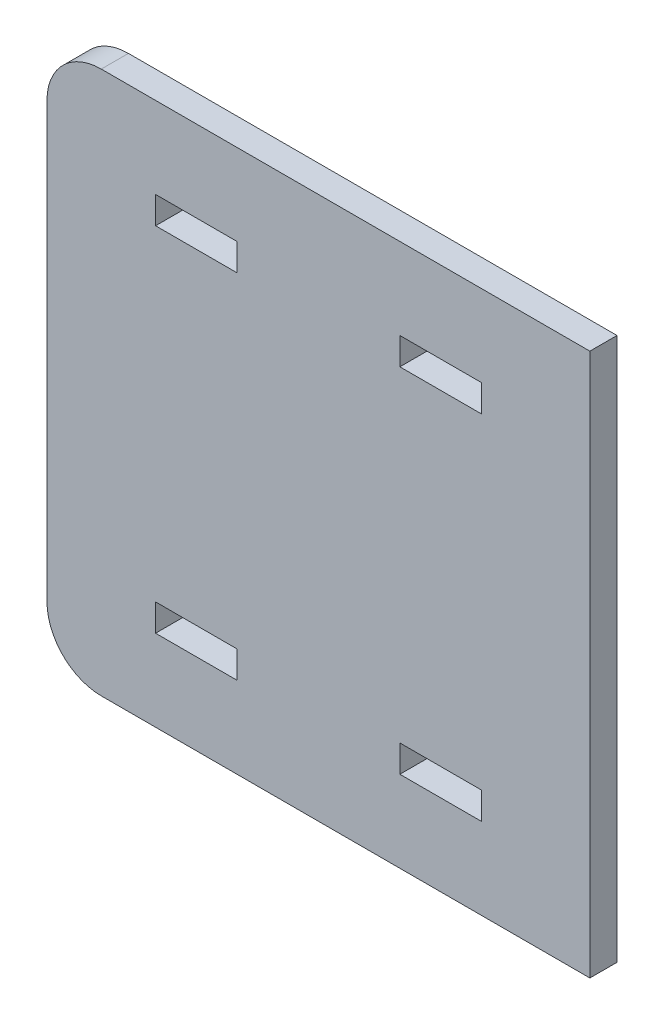
ISO-10303-21;
HEADER;
FILE_DESCRIPTION(('STEP AP214'),'2;1');
FILE_NAME('part.step','',(''),(''),'','','');
FILE_SCHEMA(('AUTOMOTIVE_DESIGN { 1 0 10303 214 1 1 1 1 }'));
ENDSEC;
DATA;
#1=APPLICATION_CONTEXT('core data for automotive mechanical design processes');
#2=APPLICATION_PROTOCOL_DEFINITION('international standard','automotive_design',2000,#1);
#3=PRODUCT_CONTEXT('',#1,'mechanical');
#4=PRODUCT('Part','Part','',(#3));
#5=PRODUCT_RELATED_PRODUCT_CATEGORY('part','',(#4));
#6=PRODUCT_DEFINITION_FORMATION('','',#4);
#7=PRODUCT_DEFINITION_CONTEXT('part definition',#1,'design');
#8=PRODUCT_DEFINITION('design','',#6,#7);
#9=PRODUCT_DEFINITION_SHAPE('','',#8);
#10=(LENGTH_UNIT() NAMED_UNIT(*) SI_UNIT(.MILLI.,.METRE.));
#11=(NAMED_UNIT(*) PLANE_ANGLE_UNIT() SI_UNIT($,.RADIAN.));
#12=(NAMED_UNIT(*) SI_UNIT($,.STERADIAN.) SOLID_ANGLE_UNIT());
#13=UNCERTAINTY_MEASURE_WITH_UNIT(LENGTH_MEASURE(1.E-05),#10,'distance_accuracy_value','');
#14=(GEOMETRIC_REPRESENTATION_CONTEXT(3) GLOBAL_UNCERTAINTY_ASSIGNED_CONTEXT((#13)) GLOBAL_UNIT_ASSIGNED_CONTEXT((#10,
#11,#12)) REPRESENTATION_CONTEXT('',''));
#15=CARTESIAN_POINT('',(0.,0.,0.));
#16=DIRECTION('',(0.,0.,1.));
#17=DIRECTION('',(1.,0.,0.));
#18=AXIS2_PLACEMENT_3D('',#15,#16,#17);
#19=CARTESIAN_POINT('',(0.,100.,5.));
#20=DIRECTION('',(0.,0.,-1.));
#21=DIRECTION('',(-1.,0.,0.));
#22=AXIS2_PLACEMENT_3D('',#19,#20,#21);
#23=PLANE('',#22);
#24=DIRECTION('',(1.,0.,0.));
#25=VECTOR('',#24,1.);
#26=CARTESIAN_POINT('',(65.,80.,5.));
#27=LINE('',#26,#25);
#28=CARTESIAN_POINT('',(65.,80.,5.));
#29=VERTEX_POINT('',#28);
#30=CARTESIAN_POINT('',(80.,80.,5.));
#31=VERTEX_POINT('',#30);
#32=EDGE_CURVE('E224',#29,#31,#27,.T.);
#33=ORIENTED_EDGE('',*,*,#32,.F.);
#34=DIRECTION('',(0.,-1.,0.));
#35=VECTOR('',#34,1.);
#36=CARTESIAN_POINT('',(65.,80.,5.));
#37=LINE('',#36,#35);
#38=CARTESIAN_POINT('',(65.,85.,5.));
#39=VERTEX_POINT('',#38);
#40=EDGE_CURVE('E232',#39,#29,#37,.T.);
#41=ORIENTED_EDGE('',*,*,#40,.F.);
#42=DIRECTION('',(-1.,0.,0.));
#43=VECTOR('',#42,1.);
#44=CARTESIAN_POINT('',(65.,85.,5.));
#45=LINE('',#44,#43);
#46=CARTESIAN_POINT('',(80.,85.,5.));
#47=VERTEX_POINT('',#46);
#48=EDGE_CURVE('E229',#47,#39,#45,.T.);
#49=ORIENTED_EDGE('',*,*,#48,.F.);
#50=DIRECTION('',(0.,1.,0.));
#51=VECTOR('',#50,1.);
#52=CARTESIAN_POINT('',(80.,80.,5.));
#53=LINE('',#52,#51);
#54=EDGE_CURVE('E226',#31,#47,#53,.T.);
#55=ORIENTED_EDGE('',*,*,#54,.F.);
#56=EDGE_LOOP('',(#33,#41,#49,#55));
#57=FACE_BOUND('',#56,.T.);
#58=DIRECTION('',(0.,-1.,0.));
#59=VECTOR('',#58,1.);
#60=CARTESIAN_POINT('',(20.,20.,5.));
#61=LINE('',#60,#59);
#62=CARTESIAN_POINT('',(20.,20.,5.));
#63=VERTEX_POINT('',#62);
#64=CARTESIAN_POINT('',(20.,15.,5.));
#65=VERTEX_POINT('',#64);
#66=EDGE_CURVE('E286',#63,#65,#61,.T.);
#67=ORIENTED_EDGE('',*,*,#66,.F.);
#68=DIRECTION('',(-1.,0.,0.));
#69=VECTOR('',#68,1.);
#70=CARTESIAN_POINT('',(20.,20.,5.));
#71=LINE('',#70,#69);
#72=CARTESIAN_POINT('',(35.,20.,5.));
#73=VERTEX_POINT('',#72);
#74=EDGE_CURVE('E294',#73,#63,#71,.T.);
#75=ORIENTED_EDGE('',*,*,#74,.F.);
#76=DIRECTION('',(0.,1.,0.));
#77=VECTOR('',#76,1.);
#78=CARTESIAN_POINT('',(35.,20.,5.));
#79=LINE('',#78,#77);
#80=CARTESIAN_POINT('',(35.,15.,5.));
#81=VERTEX_POINT('',#80);
#82=EDGE_CURVE('E291',#81,#73,#79,.T.);
#83=ORIENTED_EDGE('',*,*,#82,.F.);
#84=DIRECTION('',(1.,0.,0.));
#85=VECTOR('',#84,1.);
#86=CARTESIAN_POINT('',(20.,15.,5.));
#87=LINE('',#86,#85);
#88=EDGE_CURVE('E288',#65,#81,#87,.T.);
#89=ORIENTED_EDGE('',*,*,#88,.F.);
#90=EDGE_LOOP('',(#67,#75,#83,#89));
#91=FACE_BOUND('',#90,.T.);
#92=DIRECTION('',(0.,-1.,0.));
#93=VECTOR('',#92,1.);
#94=CARTESIAN_POINT('',(0.,0.,5.));
#95=LINE('',#94,#93);
#96=CARTESIAN_POINT('',(0.,90.,5.));
#97=VERTEX_POINT('',#96);
#98=CARTESIAN_POINT('',(0.,10.,5.));
#99=VERTEX_POINT('',#98);
#100=EDGE_CURVE('E317',#97,#99,#95,.T.);
#101=ORIENTED_EDGE('',*,*,#100,.T.);
#102=CARTESIAN_POINT('',(10.,10.,5.));
#103=DIRECTION('',(0.,0.,-1.));
#104=DIRECTION('',(-1.,0.,0.));
#105=AXIS2_PLACEMENT_3D('',#102,#103,#104);
#106=CIRCLE('',#105,10.);
#107=CARTESIAN_POINT('',(10.,0.,5.));
#108=VERTEX_POINT('',#107);
#109=EDGE_CURVE('E39',#99,#108,#106,.F.);
#110=ORIENTED_EDGE('',*,*,#109,.T.);
#111=DIRECTION('',(1.,0.,0.));
#112=VECTOR('',#111,1.);
#113=CARTESIAN_POINT('',(0.,0.,5.));
#114=LINE('',#113,#112);
#115=CARTESIAN_POINT('',(100.,0.,5.));
#116=VERTEX_POINT('',#115);
#117=EDGE_CURVE('E319',#108,#116,#114,.T.);
#118=ORIENTED_EDGE('',*,*,#117,.T.);
#119=DIRECTION('',(0.,1.,0.));
#120=VECTOR('',#119,1.);
#121=CARTESIAN_POINT('',(100.,0.,5.));
#122=LINE('',#121,#120);
#123=CARTESIAN_POINT('',(100.,100.,5.));
#124=VERTEX_POINT('',#123);
#125=EDGE_CURVE('E322',#116,#124,#122,.T.);
#126=ORIENTED_EDGE('',*,*,#125,.T.);
#127=DIRECTION('',(-1.,0.,0.));
#128=VECTOR('',#127,1.);
#129=CARTESIAN_POINT('',(0.,100.,5.));
#130=LINE('',#129,#128);
#131=CARTESIAN_POINT('',(10.,100.,5.));
#132=VERTEX_POINT('',#131);
#133=EDGE_CURVE('E324',#124,#132,#130,.T.);
#134=ORIENTED_EDGE('',*,*,#133,.T.);
#135=CARTESIAN_POINT('',(10.,90.,5.));
#136=DIRECTION('',(0.,0.,-1.));
#137=DIRECTION('',(-1.,0.,0.));
#138=AXIS2_PLACEMENT_3D('',#135,#136,#137);
#139=CIRCLE('',#138,10.);
#140=EDGE_CURVE('E349',#132,#97,#139,.F.);
#141=ORIENTED_EDGE('',*,*,#140,.T.);
#142=EDGE_LOOP('',(#101,#110,#118,#126,#134,#141));
#143=FACE_BOUND('',#142,.T.);
#144=DIRECTION('',(0.,-1.,0.));
#145=VECTOR('',#144,1.);
#146=CARTESIAN_POINT('',(65.,20.,5.));
#147=LINE('',#146,#145);
#148=CARTESIAN_POINT('',(65.,20.,5.));
#149=VERTEX_POINT('',#148);
#150=CARTESIAN_POINT('',(65.,15.,5.));
#151=VERTEX_POINT('',#150);
#152=EDGE_CURVE('E255',#149,#151,#147,.T.);
#153=ORIENTED_EDGE('',*,*,#152,.F.);
#154=DIRECTION('',(-1.,0.,0.));
#155=VECTOR('',#154,1.);
#156=CARTESIAN_POINT('',(65.,20.,5.));
#157=LINE('',#156,#155);
#158=CARTESIAN_POINT('',(80.,20.,5.));
#159=VERTEX_POINT('',#158);
#160=EDGE_CURVE('E263',#159,#149,#157,.T.);
#161=ORIENTED_EDGE('',*,*,#160,.F.);
#162=DIRECTION('',(0.,1.,0.));
#163=VECTOR('',#162,1.);
#164=CARTESIAN_POINT('',(80.,20.,5.));
#165=LINE('',#164,#163);
#166=CARTESIAN_POINT('',(80.,15.,5.));
#167=VERTEX_POINT('',#166);
#168=EDGE_CURVE('E260',#167,#159,#165,.T.);
#169=ORIENTED_EDGE('',*,*,#168,.F.);
#170=DIRECTION('',(1.,0.,0.));
#171=VECTOR('',#170,1.);
#172=CARTESIAN_POINT('',(65.,15.,5.));
#173=LINE('',#172,#171);
#174=EDGE_CURVE('E257',#151,#167,#173,.T.);
#175=ORIENTED_EDGE('',*,*,#174,.F.);
#176=EDGE_LOOP('',(#153,#161,#169,#175));
#177=FACE_BOUND('',#176,.T.);
#178=DIRECTION('',(1.,0.,0.));
#179=VECTOR('',#178,1.);
#180=CARTESIAN_POINT('',(20.,80.,5.));
#181=LINE('',#180,#179);
#182=CARTESIAN_POINT('',(20.,80.,5.));
#183=VERTEX_POINT('',#182);
#184=CARTESIAN_POINT('',(35.,80.,5.));
#185=VERTEX_POINT('',#184);
#186=EDGE_CURVE('E183',#183,#185,#181,.T.);
#187=ORIENTED_EDGE('',*,*,#186,.F.);
#188=DIRECTION('',(0.,-1.,0.));
#189=VECTOR('',#188,1.);
#190=CARTESIAN_POINT('',(20.,80.,5.));
#191=LINE('',#190,#189);
#192=CARTESIAN_POINT('',(20.,85.,5.));
#193=VERTEX_POINT('',#192);
#194=EDGE_CURVE('E208',#193,#183,#191,.T.);
#195=ORIENTED_EDGE('',*,*,#194,.F.);
#196=DIRECTION('',(-1.,0.,0.));
#197=VECTOR('',#196,1.);
#198=CARTESIAN_POINT('',(20.,85.,5.));
#199=LINE('',#198,#197);
#200=CARTESIAN_POINT('',(35.,85.,5.));
#201=VERTEX_POINT('',#200);
#202=EDGE_CURVE('E206',#201,#193,#199,.T.);
#203=ORIENTED_EDGE('',*,*,#202,.F.);
#204=DIRECTION('',(0.,1.,0.));
#205=VECTOR('',#204,1.);
#206=CARTESIAN_POINT('',(35.,80.,5.));
#207=LINE('',#206,#205);
#208=EDGE_CURVE('E193',#185,#201,#207,.T.);
#209=ORIENTED_EDGE('',*,*,#208,.F.);
#210=EDGE_LOOP('',(#187,#195,#203,#209));
#211=FACE_BOUND('',#210,.T.);
#212=ADVANCED_FACE('F31',(#57,#91,#143,#177,#211),#23,.F.);
#213=CARTESIAN_POINT('',(0.,100.,0.));
#214=DIRECTION('',(0.,0.,-1.));
#215=DIRECTION('',(-1.,0.,0.));
#216=AXIS2_PLACEMENT_3D('',#213,#214,#215);
#217=PLANE('',#216);
#218=DIRECTION('',(0.,-1.,0.));
#219=VECTOR('',#218,1.);
#220=CARTESIAN_POINT('',(65.,80.,0.));
#221=LINE('',#220,#219);
#222=CARTESIAN_POINT('',(65.,85.,0.));
#223=VERTEX_POINT('',#222);
#224=CARTESIAN_POINT('',(65.,80.,0.));
#225=VERTEX_POINT('',#224);
#226=EDGE_CURVE('E227',#223,#225,#221,.T.);
#227=ORIENTED_EDGE('',*,*,#226,.T.);
#228=DIRECTION('',(1.,0.,0.));
#229=VECTOR('',#228,1.);
#230=CARTESIAN_POINT('',(65.,80.,0.));
#231=LINE('',#230,#229);
#232=CARTESIAN_POINT('',(80.,80.,0.));
#233=VERTEX_POINT('',#232);
#234=EDGE_CURVE('E201',#225,#233,#231,.T.);
#235=ORIENTED_EDGE('',*,*,#234,.T.);
#236=DIRECTION('',(0.,1.,0.));
#237=VECTOR('',#236,1.);
#238=CARTESIAN_POINT('',(80.,80.,0.));
#239=LINE('',#238,#237);
#240=CARTESIAN_POINT('',(80.,85.,0.));
#241=VERTEX_POINT('',#240);
#242=EDGE_CURVE('E237',#233,#241,#239,.T.);
#243=ORIENTED_EDGE('',*,*,#242,.T.);
#244=DIRECTION('',(-1.,0.,0.));
#245=VECTOR('',#244,1.);
#246=CARTESIAN_POINT('',(65.,85.,0.));
#247=LINE('',#246,#245);
#248=EDGE_CURVE('E240',#241,#223,#247,.T.);
#249=ORIENTED_EDGE('',*,*,#248,.T.);
#250=EDGE_LOOP('',(#227,#235,#243,#249));
#251=FACE_BOUND('',#250,.T.);
#252=DIRECTION('',(-1.,0.,0.));
#253=VECTOR('',#252,1.);
#254=CARTESIAN_POINT('',(20.,20.,0.));
#255=LINE('',#254,#253);
#256=CARTESIAN_POINT('',(35.,20.,0.));
#257=VERTEX_POINT('',#256);
#258=CARTESIAN_POINT('',(20.,20.,0.));
#259=VERTEX_POINT('',#258);
#260=EDGE_CURVE('E289',#257,#259,#255,.T.);
#261=ORIENTED_EDGE('',*,*,#260,.T.);
#262=DIRECTION('',(0.,-1.,0.));
#263=VECTOR('',#262,1.);
#264=CARTESIAN_POINT('',(20.,20.,0.));
#265=LINE('',#264,#263);
#266=CARTESIAN_POINT('',(20.,15.,0.));
#267=VERTEX_POINT('',#266);
#268=EDGE_CURVE('E285',#259,#267,#265,.T.);
#269=ORIENTED_EDGE('',*,*,#268,.T.);
#270=DIRECTION('',(1.,0.,0.));
#271=VECTOR('',#270,1.);
#272=CARTESIAN_POINT('',(20.,15.,0.));
#273=LINE('',#272,#271);
#274=CARTESIAN_POINT('',(35.,15.,0.));
#275=VERTEX_POINT('',#274);
#276=EDGE_CURVE('E299',#267,#275,#273,.T.);
#277=ORIENTED_EDGE('',*,*,#276,.T.);
#278=DIRECTION('',(0.,1.,0.));
#279=VECTOR('',#278,1.);
#280=CARTESIAN_POINT('',(35.,20.,0.));
#281=LINE('',#280,#279);
#282=EDGE_CURVE('E302',#275,#257,#281,.T.);
#283=ORIENTED_EDGE('',*,*,#282,.T.);
#284=EDGE_LOOP('',(#261,#269,#277,#283));
#285=FACE_BOUND('',#284,.T.);
#286=DIRECTION('',(1.,0.,0.));
#287=VECTOR('',#286,1.);
#288=CARTESIAN_POINT('',(0.,0.,0.));
#289=LINE('',#288,#287);
#290=CARTESIAN_POINT('',(10.,0.,0.));
#291=VERTEX_POINT('',#290);
#292=CARTESIAN_POINT('',(100.,0.,0.));
#293=VERTEX_POINT('',#292);
#294=EDGE_CURVE('E328',#291,#293,#289,.T.);
#295=ORIENTED_EDGE('',*,*,#294,.F.);
#296=CARTESIAN_POINT('',(10.,10.,0.));
#297=DIRECTION('',(0.,0.,-1.));
#298=DIRECTION('',(-1.,0.,0.));
#299=AXIS2_PLACEMENT_3D('',#296,#297,#298);
#300=CIRCLE('',#299,10.);
#301=CARTESIAN_POINT('',(0.,10.,0.));
#302=VERTEX_POINT('',#301);
#303=EDGE_CURVE('E343',#291,#302,#300,.T.);
#304=ORIENTED_EDGE('',*,*,#303,.T.);
#305=DIRECTION('',(0.,-1.,0.));
#306=VECTOR('',#305,1.);
#307=CARTESIAN_POINT('',(0.,0.,0.));
#308=LINE('',#307,#306);
#309=CARTESIAN_POINT('',(0.,90.,0.));
#310=VERTEX_POINT('',#309);
#311=EDGE_CURVE('E316',#310,#302,#308,.T.);
#312=ORIENTED_EDGE('',*,*,#311,.F.);
#313=CARTESIAN_POINT('',(10.,90.,0.));
#314=DIRECTION('',(0.,0.,-1.));
#315=DIRECTION('',(-1.,0.,0.));
#316=AXIS2_PLACEMENT_3D('',#313,#314,#315);
#317=CIRCLE('',#316,10.);
#318=CARTESIAN_POINT('',(10.,100.,0.));
#319=VERTEX_POINT('',#318);
#320=EDGE_CURVE('E341',#310,#319,#317,.T.);
#321=ORIENTED_EDGE('',*,*,#320,.T.);
#322=DIRECTION('',(-1.,0.,0.));
#323=VECTOR('',#322,1.);
#324=CARTESIAN_POINT('',(0.,100.,0.));
#325=LINE('',#324,#323);
#326=CARTESIAN_POINT('',(100.,100.,0.));
#327=VERTEX_POINT('',#326);
#328=EDGE_CURVE('E320',#327,#319,#325,.T.);
#329=ORIENTED_EDGE('',*,*,#328,.F.);
#330=DIRECTION('',(0.,1.,0.));
#331=VECTOR('',#330,1.);
#332=CARTESIAN_POINT('',(100.,0.,0.));
#333=LINE('',#332,#331);
#334=EDGE_CURVE('E330',#293,#327,#333,.T.);
#335=ORIENTED_EDGE('',*,*,#334,.F.);
#336=EDGE_LOOP('',(#295,#304,#312,#321,#329,#335));
#337=FACE_BOUND('',#336,.T.);
#338=DIRECTION('',(-1.,0.,0.));
#339=VECTOR('',#338,1.);
#340=CARTESIAN_POINT('',(65.,20.,0.));
#341=LINE('',#340,#339);
#342=CARTESIAN_POINT('',(80.,20.,0.));
#343=VERTEX_POINT('',#342);
#344=CARTESIAN_POINT('',(65.,20.,0.));
#345=VERTEX_POINT('',#344);
#346=EDGE_CURVE('E258',#343,#345,#341,.T.);
#347=ORIENTED_EDGE('',*,*,#346,.T.);
#348=DIRECTION('',(0.,-1.,0.));
#349=VECTOR('',#348,1.);
#350=CARTESIAN_POINT('',(65.,20.,0.));
#351=LINE('',#350,#349);
#352=CARTESIAN_POINT('',(65.,15.,0.));
#353=VERTEX_POINT('',#352);
#354=EDGE_CURVE('E254',#345,#353,#351,.T.);
#355=ORIENTED_EDGE('',*,*,#354,.T.);
#356=DIRECTION('',(1.,0.,0.));
#357=VECTOR('',#356,1.);
#358=CARTESIAN_POINT('',(65.,15.,0.));
#359=LINE('',#358,#357);
#360=CARTESIAN_POINT('',(80.,15.,0.));
#361=VERTEX_POINT('',#360);
#362=EDGE_CURVE('E268',#353,#361,#359,.T.);
#363=ORIENTED_EDGE('',*,*,#362,.T.);
#364=DIRECTION('',(0.,1.,0.));
#365=VECTOR('',#364,1.);
#366=CARTESIAN_POINT('',(80.,20.,0.));
#367=LINE('',#366,#365);
#368=EDGE_CURVE('E271',#361,#343,#367,.T.);
#369=ORIENTED_EDGE('',*,*,#368,.T.);
#370=EDGE_LOOP('',(#347,#355,#363,#369));
#371=FACE_BOUND('',#370,.T.);
#372=DIRECTION('',(0.,-1.,0.));
#373=VECTOR('',#372,1.);
#374=CARTESIAN_POINT('',(20.,80.,0.));
#375=LINE('',#374,#373);
#376=CARTESIAN_POINT('',(20.,85.,0.));
#377=VERTEX_POINT('',#376);
#378=CARTESIAN_POINT('',(20.,80.,0.));
#379=VERTEX_POINT('',#378);
#380=EDGE_CURVE('E194',#377,#379,#375,.T.);
#381=ORIENTED_EDGE('',*,*,#380,.T.);
#382=DIRECTION('',(1.,0.,0.));
#383=VECTOR('',#382,1.);
#384=CARTESIAN_POINT('',(20.,80.,0.));
#385=LINE('',#384,#383);
#386=CARTESIAN_POINT('',(35.,80.,0.));
#387=VERTEX_POINT('',#386);
#388=EDGE_CURVE('E212',#379,#387,#385,.T.);
#389=ORIENTED_EDGE('',*,*,#388,.T.);
#390=DIRECTION('',(0.,1.,0.));
#391=VECTOR('',#390,1.);
#392=CARTESIAN_POINT('',(35.,80.,0.));
#393=LINE('',#392,#391);
#394=CARTESIAN_POINT('',(35.,85.,0.));
#395=VERTEX_POINT('',#394);
#396=EDGE_CURVE('E200',#387,#395,#393,.T.);
#397=ORIENTED_EDGE('',*,*,#396,.T.);
#398=DIRECTION('',(-1.,0.,0.));
#399=VECTOR('',#398,1.);
#400=CARTESIAN_POINT('',(20.,85.,0.));
#401=LINE('',#400,#399);
#402=EDGE_CURVE('E215',#395,#377,#401,.T.);
#403=ORIENTED_EDGE('',*,*,#402,.T.);
#404=EDGE_LOOP('',(#381,#389,#397,#403));
#405=FACE_BOUND('',#404,.T.);
#406=ADVANCED_FACE('F364',(#251,#285,#337,#371,#405),#217,.T.);
#407=CARTESIAN_POINT('',(0.,0.,5.));
#408=DIRECTION('',(1.,0.,0.));
#409=DIRECTION('',(0.,0.,-1.));
#410=AXIS2_PLACEMENT_3D('',#407,#408,#409);
#411=PLANE('',#410);
#412=ORIENTED_EDGE('',*,*,#311,.T.);
#413=DIRECTION('',(0.,0.,-1.));
#414=VECTOR('',#413,1.);
#415=CARTESIAN_POINT('',(0.,10.,5.));
#416=LINE('',#415,#414);
#417=EDGE_CURVE('E52',#302,#99,#416,.F.);
#418=ORIENTED_EDGE('',*,*,#417,.T.);
#419=ORIENTED_EDGE('',*,*,#100,.F.);
#420=DIRECTION('',(0.,0.,-1.));
#421=VECTOR('',#420,1.);
#422=CARTESIAN_POINT('',(0.,90.,5.));
#423=LINE('',#422,#421);
#424=EDGE_CURVE('E345',#97,#310,#423,.T.);
#425=ORIENTED_EDGE('',*,*,#424,.T.);
#426=EDGE_LOOP('',(#412,#418,#419,#425));
#427=FACE_BOUND('',#426,.T.);
#428=ADVANCED_FACE('F367',(#427),#411,.F.);
#429=CARTESIAN_POINT('',(0.,0.,5.));
#430=DIRECTION('',(0.,1.,0.));
#431=DIRECTION('',(0.,0.,1.));
#432=AXIS2_PLACEMENT_3D('',#429,#430,#431);
#433=PLANE('',#432);
#434=ORIENTED_EDGE('',*,*,#117,.F.);
#435=DIRECTION('',(0.,0.,-1.));
#436=VECTOR('',#435,1.);
#437=CARTESIAN_POINT('',(10.,0.,5.));
#438=LINE('',#437,#436);
#439=EDGE_CURVE('E338',#108,#291,#438,.T.);
#440=ORIENTED_EDGE('',*,*,#439,.T.);
#441=ORIENTED_EDGE('',*,*,#294,.T.);
#442=DIRECTION('',(0.,0.,-1.));
#443=VECTOR('',#442,1.);
#444=CARTESIAN_POINT('',(100.,0.,5.));
#445=LINE('',#444,#443);
#446=EDGE_CURVE('E335',#116,#293,#445,.T.);
#447=ORIENTED_EDGE('',*,*,#446,.F.);
#448=EDGE_LOOP('',(#434,#440,#441,#447));
#449=FACE_BOUND('',#448,.T.);
#450=ADVANCED_FACE('F358',(#449),#433,.F.);
#451=CARTESIAN_POINT('',(100.,0.,5.));
#452=DIRECTION('',(-1.,0.,0.));
#453=DIRECTION('',(0.,0.,1.));
#454=AXIS2_PLACEMENT_3D('',#451,#452,#453);
#455=PLANE('',#454);
#456=ORIENTED_EDGE('',*,*,#334,.T.);
#457=DIRECTION('',(0.,0.,-1.));
#458=VECTOR('',#457,1.);
#459=CARTESIAN_POINT('',(100.,100.,5.));
#460=LINE('',#459,#458);
#461=EDGE_CURVE('E326',#124,#327,#460,.T.);
#462=ORIENTED_EDGE('',*,*,#461,.F.);
#463=ORIENTED_EDGE('',*,*,#125,.F.);
#464=ORIENTED_EDGE('',*,*,#446,.T.);
#465=EDGE_LOOP('',(#456,#462,#463,#464));
#466=FACE_BOUND('',#465,.T.);
#467=ADVANCED_FACE('F375',(#466),#455,.F.);
#468=CARTESIAN_POINT('',(0.,100.,5.));
#469=DIRECTION('',(0.,-1.,0.));
#470=DIRECTION('',(0.,0.,-1.));
#471=AXIS2_PLACEMENT_3D('',#468,#469,#470);
#472=PLANE('',#471);
#473=ORIENTED_EDGE('',*,*,#328,.T.);
#474=DIRECTION('',(0.,0.,-1.));
#475=VECTOR('',#474,1.);
#476=CARTESIAN_POINT('',(10.,100.,5.));
#477=LINE('',#476,#475);
#478=EDGE_CURVE('E11',#319,#132,#477,.F.);
#479=ORIENTED_EDGE('',*,*,#478,.T.);
#480=ORIENTED_EDGE('',*,*,#133,.F.);
#481=ORIENTED_EDGE('',*,*,#461,.T.);
#482=EDGE_LOOP('',(#473,#479,#480,#481));
#483=FACE_BOUND('',#482,.T.);
#484=ADVANCED_FACE('F372',(#483),#472,.F.);
#485=CARTESIAN_POINT('',(20.,20.,5.));
#486=DIRECTION('',(1.,0.,0.));
#487=DIRECTION('',(0.,1.,0.));
#488=AXIS2_PLACEMENT_3D('',#485,#486,#487);
#489=PLANE('',#488);
#490=ORIENTED_EDGE('',*,*,#268,.F.);
#491=DIRECTION('',(0.,0.,-1.));
#492=VECTOR('',#491,1.);
#493=CARTESIAN_POINT('',(20.,20.,5.));
#494=LINE('',#493,#492);
#495=EDGE_CURVE('E296',#63,#259,#494,.T.);
#496=ORIENTED_EDGE('',*,*,#495,.F.);
#497=ORIENTED_EDGE('',*,*,#66,.T.);
#498=DIRECTION('',(0.,0.,-1.));
#499=VECTOR('',#498,1.);
#500=CARTESIAN_POINT('',(20.,15.,5.));
#501=LINE('',#500,#499);
#502=EDGE_CURVE('E313',#65,#267,#501,.T.);
#503=ORIENTED_EDGE('',*,*,#502,.T.);
#504=EDGE_LOOP('',(#490,#496,#497,#503));
#505=FACE_BOUND('',#504,.T.);
#506=ADVANCED_FACE('F382',(#505),#489,.T.);
#507=CARTESIAN_POINT('',(20.,15.,5.));
#508=DIRECTION('',(0.,1.,0.));
#509=DIRECTION('',(-1.,0.,0.));
#510=AXIS2_PLACEMENT_3D('',#507,#508,#509);
#511=PLANE('',#510);
#512=ORIENTED_EDGE('',*,*,#276,.F.);
#513=ORIENTED_EDGE('',*,*,#502,.F.);
#514=ORIENTED_EDGE('',*,*,#88,.T.);
#515=DIRECTION('',(0.,0.,-1.));
#516=VECTOR('',#515,1.);
#517=CARTESIAN_POINT('',(35.,15.,5.));
#518=LINE('',#517,#516);
#519=EDGE_CURVE('E311',#81,#275,#518,.T.);
#520=ORIENTED_EDGE('',*,*,#519,.T.);
#521=EDGE_LOOP('',(#512,#513,#514,#520));
#522=FACE_BOUND('',#521,.T.);
#523=ADVANCED_FACE('F398',(#522),#511,.T.);
#524=CARTESIAN_POINT('',(35.,20.,5.));
#525=DIRECTION('',(-1.,0.,0.));
#526=DIRECTION('',(0.,0.,1.));
#527=AXIS2_PLACEMENT_3D('',#524,#525,#526);
#528=PLANE('',#527);
#529=ORIENTED_EDGE('',*,*,#282,.F.);
#530=ORIENTED_EDGE('',*,*,#519,.F.);
#531=ORIENTED_EDGE('',*,*,#82,.T.);
#532=DIRECTION('',(0.,0.,-1.));
#533=VECTOR('',#532,1.);
#534=CARTESIAN_POINT('',(35.,20.,5.));
#535=LINE('',#534,#533);
#536=EDGE_CURVE('E309',#73,#257,#535,.T.);
#537=ORIENTED_EDGE('',*,*,#536,.T.);
#538=EDGE_LOOP('',(#529,#530,#531,#537));
#539=FACE_BOUND('',#538,.T.);
#540=ADVANCED_FACE('F402',(#539),#528,.T.);
#541=CARTESIAN_POINT('',(20.,20.,5.));
#542=DIRECTION('',(0.,-1.,0.));
#543=DIRECTION('',(0.,0.,-1.));
#544=AXIS2_PLACEMENT_3D('',#541,#542,#543);
#545=PLANE('',#544);
#546=ORIENTED_EDGE('',*,*,#260,.F.);
#547=ORIENTED_EDGE('',*,*,#536,.F.);
#548=ORIENTED_EDGE('',*,*,#74,.T.);
#549=ORIENTED_EDGE('',*,*,#495,.T.);
#550=EDGE_LOOP('',(#546,#547,#548,#549));
#551=FACE_BOUND('',#550,.T.);
#552=ADVANCED_FACE('F406',(#551),#545,.T.);
#553=CARTESIAN_POINT('',(65.,20.,5.));
#554=DIRECTION('',(1.,0.,0.));
#555=DIRECTION('',(0.,0.,-1.));
#556=AXIS2_PLACEMENT_3D('',#553,#554,#555);
#557=PLANE('',#556);
#558=ORIENTED_EDGE('',*,*,#354,.F.);
#559=DIRECTION('',(0.,0.,-1.));
#560=VECTOR('',#559,1.);
#561=CARTESIAN_POINT('',(65.,20.,5.));
#562=LINE('',#561,#560);
#563=EDGE_CURVE('E265',#149,#345,#562,.T.);
#564=ORIENTED_EDGE('',*,*,#563,.F.);
#565=ORIENTED_EDGE('',*,*,#152,.T.);
#566=DIRECTION('',(0.,0.,-1.));
#567=VECTOR('',#566,1.);
#568=CARTESIAN_POINT('',(65.,15.,5.));
#569=LINE('',#568,#567);
#570=EDGE_CURVE('E282',#151,#353,#569,.T.);
#571=ORIENTED_EDGE('',*,*,#570,.T.);
#572=EDGE_LOOP('',(#558,#564,#565,#571));
#573=FACE_BOUND('',#572,.T.);
#574=ADVANCED_FACE('F410',(#573),#557,.T.);
#575=CARTESIAN_POINT('',(65.,15.,5.));
#576=DIRECTION('',(0.,1.,0.));
#577=DIRECTION('',(0.,0.,1.));
#578=AXIS2_PLACEMENT_3D('',#575,#576,#577);
#579=PLANE('',#578);
#580=ORIENTED_EDGE('',*,*,#362,.F.);
#581=ORIENTED_EDGE('',*,*,#570,.F.);
#582=ORIENTED_EDGE('',*,*,#174,.T.);
#583=DIRECTION('',(0.,0.,-1.));
#584=VECTOR('',#583,1.);
#585=CARTESIAN_POINT('',(80.,15.,5.));
#586=LINE('',#585,#584);
#587=EDGE_CURVE('E280',#167,#361,#586,.T.);
#588=ORIENTED_EDGE('',*,*,#587,.T.);
#589=EDGE_LOOP('',(#580,#581,#582,#588));
#590=FACE_BOUND('',#589,.T.);
#591=ADVANCED_FACE('F414',(#590),#579,.T.);
#592=CARTESIAN_POINT('',(80.,20.,5.));
#593=DIRECTION('',(-1.,0.,0.));
#594=DIRECTION('',(0.,0.,1.));
#595=AXIS2_PLACEMENT_3D('',#592,#593,#594);
#596=PLANE('',#595);
#597=ORIENTED_EDGE('',*,*,#368,.F.);
#598=ORIENTED_EDGE('',*,*,#587,.F.);
#599=ORIENTED_EDGE('',*,*,#168,.T.);
#600=DIRECTION('',(0.,0.,-1.));
#601=VECTOR('',#600,1.);
#602=CARTESIAN_POINT('',(80.,20.,5.));
#603=LINE('',#602,#601);
#604=EDGE_CURVE('E278',#159,#343,#603,.T.);
#605=ORIENTED_EDGE('',*,*,#604,.T.);
#606=EDGE_LOOP('',(#597,#598,#599,#605));
#607=FACE_BOUND('',#606,.T.);
#608=ADVANCED_FACE('F418',(#607),#596,.T.);
#609=CARTESIAN_POINT('',(65.,20.,5.));
#610=DIRECTION('',(0.,-1.,0.));
#611=DIRECTION('',(1.,0.,0.));
#612=AXIS2_PLACEMENT_3D('',#609,#610,#611);
#613=PLANE('',#612);
#614=ORIENTED_EDGE('',*,*,#346,.F.);
#615=ORIENTED_EDGE('',*,*,#604,.F.);
#616=ORIENTED_EDGE('',*,*,#160,.T.);
#617=ORIENTED_EDGE('',*,*,#563,.T.);
#618=EDGE_LOOP('',(#614,#615,#616,#617));
#619=FACE_BOUND('',#618,.T.);
#620=ADVANCED_FACE('F422',(#619),#613,.T.);
#621=CARTESIAN_POINT('',(65.,80.,5.));
#622=DIRECTION('',(0.,1.,0.));
#623=DIRECTION('',(0.,0.,1.));
#624=AXIS2_PLACEMENT_3D('',#621,#622,#623);
#625=PLANE('',#624);
#626=ORIENTED_EDGE('',*,*,#234,.F.);
#627=DIRECTION('',(0.,0.,-1.));
#628=VECTOR('',#627,1.);
#629=CARTESIAN_POINT('',(65.,80.,5.));
#630=LINE('',#629,#628);
#631=EDGE_CURVE('E234',#29,#225,#630,.T.);
#632=ORIENTED_EDGE('',*,*,#631,.F.);
#633=ORIENTED_EDGE('',*,*,#32,.T.);
#634=DIRECTION('',(0.,0.,-1.));
#635=VECTOR('',#634,1.);
#636=CARTESIAN_POINT('',(80.,80.,5.));
#637=LINE('',#636,#635);
#638=EDGE_CURVE('E251',#31,#233,#637,.T.);
#639=ORIENTED_EDGE('',*,*,#638,.T.);
#640=EDGE_LOOP('',(#626,#632,#633,#639));
#641=FACE_BOUND('',#640,.T.);
#642=ADVANCED_FACE('F426',(#641),#625,.T.);
#643=CARTESIAN_POINT('',(80.,80.,5.));
#644=DIRECTION('',(-1.,0.,0.));
#645=DIRECTION('',(0.,0.,1.));
#646=AXIS2_PLACEMENT_3D('',#643,#644,#645);
#647=PLANE('',#646);
#648=ORIENTED_EDGE('',*,*,#242,.F.);
#649=ORIENTED_EDGE('',*,*,#638,.F.);
#650=ORIENTED_EDGE('',*,*,#54,.T.);
#651=DIRECTION('',(0.,0.,-1.));
#652=VECTOR('',#651,1.);
#653=CARTESIAN_POINT('',(80.,85.,5.));
#654=LINE('',#653,#652);
#655=EDGE_CURVE('E249',#47,#241,#654,.T.);
#656=ORIENTED_EDGE('',*,*,#655,.T.);
#657=EDGE_LOOP('',(#648,#649,#650,#656));
#658=FACE_BOUND('',#657,.T.);
#659=ADVANCED_FACE('F430',(#658),#647,.T.);
#660=CARTESIAN_POINT('',(65.,85.,5.));
#661=DIRECTION('',(0.,-1.,0.));
#662=DIRECTION('',(0.,0.,-1.));
#663=AXIS2_PLACEMENT_3D('',#660,#661,#662);
#664=PLANE('',#663);
#665=ORIENTED_EDGE('',*,*,#248,.F.);
#666=ORIENTED_EDGE('',*,*,#655,.F.);
#667=ORIENTED_EDGE('',*,*,#48,.T.);
#668=DIRECTION('',(0.,0.,-1.));
#669=VECTOR('',#668,1.);
#670=CARTESIAN_POINT('',(65.,85.,5.));
#671=LINE('',#670,#669);
#672=EDGE_CURVE('E247',#39,#223,#671,.T.);
#673=ORIENTED_EDGE('',*,*,#672,.T.);
#674=EDGE_LOOP('',(#665,#666,#667,#673));
#675=FACE_BOUND('',#674,.T.);
#676=ADVANCED_FACE('F434',(#675),#664,.T.);
#677=CARTESIAN_POINT('',(65.,80.,5.));
#678=DIRECTION('',(1.,0.,0.));
#679=DIRECTION('',(0.,0.,-1.));
#680=AXIS2_PLACEMENT_3D('',#677,#678,#679);
#681=PLANE('',#680);
#682=ORIENTED_EDGE('',*,*,#226,.F.);
#683=ORIENTED_EDGE('',*,*,#672,.F.);
#684=ORIENTED_EDGE('',*,*,#40,.T.);
#685=ORIENTED_EDGE('',*,*,#631,.T.);
#686=EDGE_LOOP('',(#682,#683,#684,#685));
#687=FACE_BOUND('',#686,.T.);
#688=ADVANCED_FACE('F438',(#687),#681,.T.);
#689=CARTESIAN_POINT('',(20.,80.,5.));
#690=DIRECTION('',(0.,1.,0.));
#691=DIRECTION('',(0.,0.,1.));
#692=AXIS2_PLACEMENT_3D('',#689,#690,#691);
#693=PLANE('',#692);
#694=ORIENTED_EDGE('',*,*,#388,.F.);
#695=DIRECTION('',(0.,0.,-1.));
#696=VECTOR('',#695,1.);
#697=CARTESIAN_POINT('',(20.,80.,5.));
#698=LINE('',#697,#696);
#699=EDGE_CURVE('E189',#183,#379,#698,.T.);
#700=ORIENTED_EDGE('',*,*,#699,.F.);
#701=ORIENTED_EDGE('',*,*,#186,.T.);
#702=DIRECTION('',(0.,0.,-1.));
#703=VECTOR('',#702,1.);
#704=CARTESIAN_POINT('',(35.,80.,5.));
#705=LINE('',#704,#703);
#706=EDGE_CURVE('E186',#185,#387,#705,.T.);
#707=ORIENTED_EDGE('',*,*,#706,.T.);
#708=EDGE_LOOP('',(#694,#700,#701,#707));
#709=FACE_BOUND('',#708,.T.);
#710=ADVANCED_FACE('F185',(#709),#693,.T.);
#711=CARTESIAN_POINT('',(35.,80.,5.));
#712=DIRECTION('',(-1.,0.,0.));
#713=DIRECTION('',(0.,0.,1.));
#714=AXIS2_PLACEMENT_3D('',#711,#712,#713);
#715=PLANE('',#714);
#716=ORIENTED_EDGE('',*,*,#396,.F.);
#717=ORIENTED_EDGE('',*,*,#706,.F.);
#718=ORIENTED_EDGE('',*,*,#208,.T.);
#719=DIRECTION('',(0.,0.,-1.));
#720=VECTOR('',#719,1.);
#721=CARTESIAN_POINT('',(35.,85.,5.));
#722=LINE('',#721,#720);
#723=EDGE_CURVE('E202',#201,#395,#722,.T.);
#724=ORIENTED_EDGE('',*,*,#723,.T.);
#725=EDGE_LOOP('',(#716,#717,#718,#724));
#726=FACE_BOUND('',#725,.T.);
#727=ADVANCED_FACE('F197',(#726),#715,.T.);
#728=CARTESIAN_POINT('',(20.,85.,5.));
#729=DIRECTION('',(0.,-1.,0.));
#730=DIRECTION('',(0.,0.,-1.));
#731=AXIS2_PLACEMENT_3D('',#728,#729,#730);
#732=PLANE('',#731);
#733=ORIENTED_EDGE('',*,*,#402,.F.);
#734=ORIENTED_EDGE('',*,*,#723,.F.);
#735=ORIENTED_EDGE('',*,*,#202,.T.);
#736=DIRECTION('',(0.,0.,-1.));
#737=VECTOR('',#736,1.);
#738=CARTESIAN_POINT('',(20.,85.,5.));
#739=LINE('',#738,#737);
#740=EDGE_CURVE('E221',#193,#377,#739,.T.);
#741=ORIENTED_EDGE('',*,*,#740,.T.);
#742=EDGE_LOOP('',(#733,#734,#735,#741));
#743=FACE_BOUND('',#742,.T.);
#744=ADVANCED_FACE('F447',(#743),#732,.T.);
#745=CARTESIAN_POINT('',(20.,80.,5.));
#746=DIRECTION('',(1.,0.,0.));
#747=DIRECTION('',(0.,1.,0.));
#748=AXIS2_PLACEMENT_3D('',#745,#746,#747);
#749=PLANE('',#748);
#750=ORIENTED_EDGE('',*,*,#380,.F.);
#751=ORIENTED_EDGE('',*,*,#740,.F.);
#752=ORIENTED_EDGE('',*,*,#194,.T.);
#753=ORIENTED_EDGE('',*,*,#699,.T.);
#754=EDGE_LOOP('',(#750,#751,#752,#753));
#755=FACE_BOUND('',#754,.T.);
#756=ADVANCED_FACE('F450',(#755),#749,.T.);
#757=CARTESIAN_POINT('',(10.,10.,5.));
#758=DIRECTION('',(0.,0.,-1.));
#759=DIRECTION('',(-1.,0.,0.));
#760=AXIS2_PLACEMENT_3D('',#757,#758,#759);
#761=CYLINDRICAL_SURFACE('',#760,10.);
#762=ORIENTED_EDGE('',*,*,#109,.F.);
#763=ORIENTED_EDGE('',*,*,#417,.F.);
#764=ORIENTED_EDGE('',*,*,#303,.F.);
#765=ORIENTED_EDGE('',*,*,#439,.F.);
#766=EDGE_LOOP('',(#762,#763,#764,#765));
#767=FACE_BOUND('',#766,.T.);
#768=ADVANCED_FACE('F361',(#767),#761,.T.);
#769=CARTESIAN_POINT('',(10.,90.,5.));
#770=DIRECTION('',(0.,0.,-1.));
#771=DIRECTION('',(-1.,0.,0.));
#772=AXIS2_PLACEMENT_3D('',#769,#770,#771);
#773=CYLINDRICAL_SURFACE('',#772,10.);
#774=ORIENTED_EDGE('',*,*,#140,.F.);
#775=ORIENTED_EDGE('',*,*,#478,.F.);
#776=ORIENTED_EDGE('',*,*,#320,.F.);
#777=ORIENTED_EDGE('',*,*,#424,.F.);
#778=EDGE_LOOP('',(#774,#775,#776,#777));
#779=FACE_BOUND('',#778,.T.);
#780=ADVANCED_FACE('F33',(#779),#773,.T.);
#781=CLOSED_SHELL('',(#212,#406,#428,#450,#467,#484,#506,#523,#540,#552,#574,#591,#608,#620,
#642,#659,#676,#688,#710,#727,#744,#756,#768,#780));
#782=MANIFOLD_SOLID_BREP('B2',#781);
#783=ADVANCED_BREP_SHAPE_REPRESENTATION('',(#18,#782),#14);
#784=SHAPE_DEFINITION_REPRESENTATION(#9,#783);
ENDSEC;
END-ISO-10303-21;
